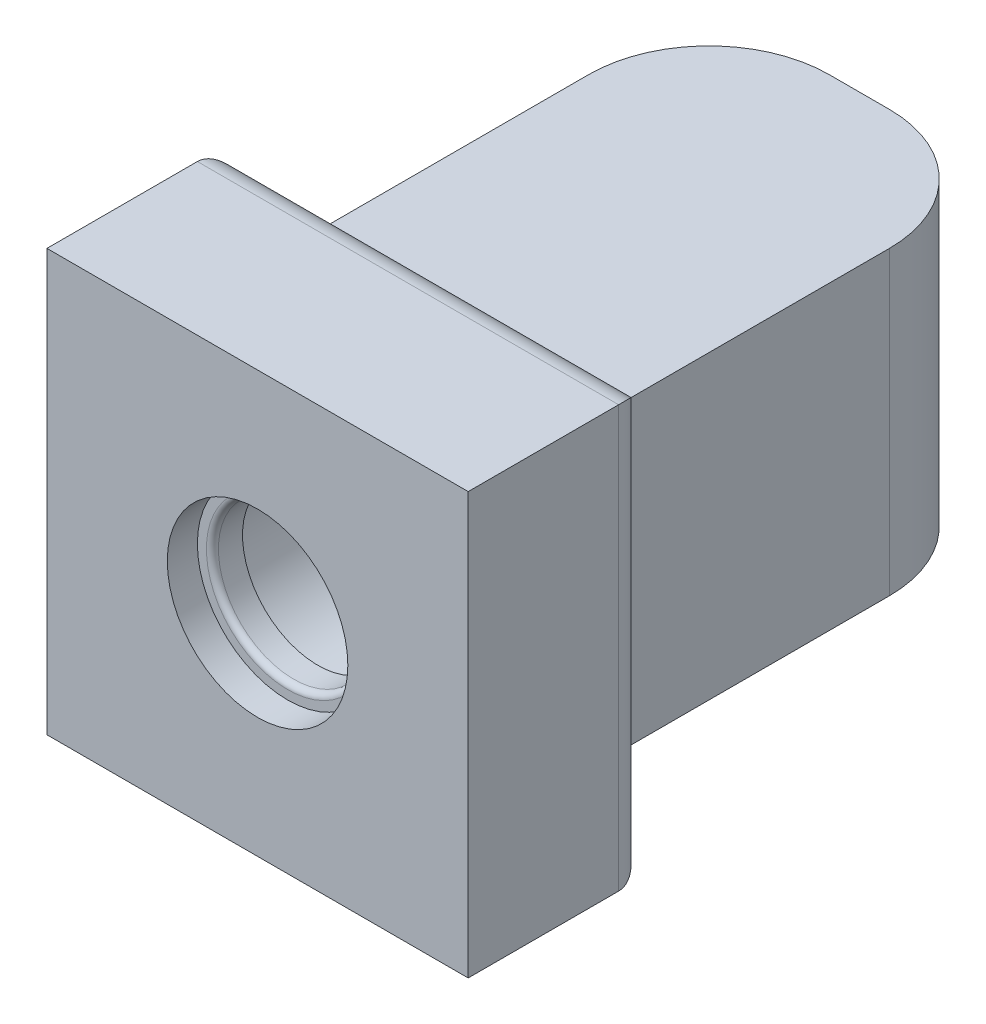
ISO-10303-21;
HEADER;
FILE_DESCRIPTION(('STEP AP214'),'2;1');
FILE_NAME('part.step','',(''),(''),'','','');
FILE_SCHEMA(('AUTOMOTIVE_DESIGN { 1 0 10303 214 1 1 1 1 }'));
ENDSEC;
DATA;
#1=APPLICATION_CONTEXT('core data for automotive mechanical design processes');
#2=APPLICATION_PROTOCOL_DEFINITION('international standard','automotive_design',2000,#1);
#3=PRODUCT_CONTEXT('',#1,'mechanical');
#4=PRODUCT('Part','Part','',(#3));
#5=PRODUCT_RELATED_PRODUCT_CATEGORY('part','',(#4));
#6=PRODUCT_DEFINITION_FORMATION('','',#4);
#7=PRODUCT_DEFINITION_CONTEXT('part definition',#1,'design');
#8=PRODUCT_DEFINITION('design','',#6,#7);
#9=PRODUCT_DEFINITION_SHAPE('','',#8);
#10=(LENGTH_UNIT() NAMED_UNIT(*) SI_UNIT(.MILLI.,.METRE.));
#11=(NAMED_UNIT(*) PLANE_ANGLE_UNIT() SI_UNIT($,.RADIAN.));
#12=(NAMED_UNIT(*) SI_UNIT($,.STERADIAN.) SOLID_ANGLE_UNIT());
#13=UNCERTAINTY_MEASURE_WITH_UNIT(LENGTH_MEASURE(1.E-05),#10,'distance_accuracy_value','');
#14=(GEOMETRIC_REPRESENTATION_CONTEXT(3) GLOBAL_UNCERTAINTY_ASSIGNED_CONTEXT((#13)) GLOBAL_UNIT_ASSIGNED_CONTEXT((#10,
#11,#12)) REPRESENTATION_CONTEXT('',''));
#15=CARTESIAN_POINT('',(0.,0.,0.));
#16=DIRECTION('',(0.,0.,1.));
#17=DIRECTION('',(1.,0.,0.));
#18=AXIS2_PLACEMENT_3D('',#15,#16,#17);
#19=CARTESIAN_POINT('',(0.,5.,-0.0500000000000001));
#20=DIRECTION('',(0.,-1.,0.));
#21=DIRECTION('',(0.,0.,-1.));
#22=AXIS2_PLACEMENT_3D('',#19,#20,#21);
#23=CYLINDRICAL_SURFACE('',#22,1.5);
#24=CARTESIAN_POINT('',(0.,0.,-0.0500000000000001));
#25=DIRECTION('',(0.,1.,0.));
#26=DIRECTION('',(0.,0.,1.));
#27=AXIS2_PLACEMENT_3D('',#24,#25,#26);
#28=CIRCLE('',#27,1.5);
#29=CARTESIAN_POINT('',(0.,0.,1.45));
#30=VERTEX_POINT('',#29);
#31=EDGE_CURVE('E295',#30,#30,#28,.T.);
#32=ORIENTED_EDGE('',*,*,#31,.F.);
#33=EDGE_LOOP('',(#32));
#34=FACE_BOUND('',#33,.T.);
#35=CARTESIAN_POINT('',(0.,3.,-0.0500000000000001));
#36=DIRECTION('',(0.,1.,0.));
#37=DIRECTION('',(0.,0.,1.));
#38=AXIS2_PLACEMENT_3D('',#35,#36,#37);
#39=CIRCLE('',#38,1.5);
#40=CARTESIAN_POINT('',(0.,3.,1.45));
#41=VERTEX_POINT('',#40);
#42=EDGE_CURVE('E155',#41,#41,#39,.T.);
#43=ORIENTED_EDGE('',*,*,#42,.T.);
#44=EDGE_LOOP('',(#43));
#45=FACE_BOUND('',#44,.T.);
#46=ADVANCED_FACE('F39',(#34,#45),#23,.F.);
#47=CARTESIAN_POINT('',(-0.500000000000001,5.,-1.5));
#48=DIRECTION('',(0.,1.,0.));
#49=DIRECTION('',(0.,0.,1.));
#50=AXIS2_PLACEMENT_3D('',#47,#48,#49);
#51=PLANE('',#50);
#52=DIRECTION('',(0.,0.,1.));
#53=VECTOR('',#52,1.);
#54=CARTESIAN_POINT('',(-2.5,5.,-1.5));
#55=LINE('',#54,#53);
#56=CARTESIAN_POINT('',(-2.5,5.,-1.5));
#57=VERTEX_POINT('',#56);
#58=CARTESIAN_POINT('',(-2.5,5.,3.));
#59=VERTEX_POINT('',#58);
#60=EDGE_CURVE('E316',#57,#59,#55,.T.);
#61=ORIENTED_EDGE('',*,*,#60,.T.);
#62=DIRECTION('',(1.,0.,0.));
#63=VECTOR('',#62,1.);
#64=CARTESIAN_POINT('',(-0.500000000000001,5.,3.));
#65=LINE('',#64,#63);
#66=CARTESIAN_POINT('',(2.5,5.,3.));
#67=VERTEX_POINT('',#66);
#68=EDGE_CURVE('E350',#59,#67,#65,.T.);
#69=ORIENTED_EDGE('',*,*,#68,.T.);
#70=DIRECTION('',(0.,0.,-1.));
#71=VECTOR('',#70,1.);
#72=CARTESIAN_POINT('',(2.5,5.,-1.5));
#73=LINE('',#72,#71);
#74=CARTESIAN_POINT('',(2.5,5.,-1.5));
#75=VERTEX_POINT('',#74);
#76=EDGE_CURVE('E303',#67,#75,#73,.T.);
#77=ORIENTED_EDGE('',*,*,#76,.T.);
#78=CARTESIAN_POINT('',(0.499999999999999,5.,-1.5));
#79=DIRECTION('',(0.,1.,0.));
#80=DIRECTION('',(0.,0.,-1.));
#81=AXIS2_PLACEMENT_3D('',#78,#79,#80);
#82=CIRCLE('',#81,2.);
#83=CARTESIAN_POINT('',(0.499999999999999,5.,-3.5));
#84=VERTEX_POINT('',#83);
#85=EDGE_CURVE('E306',#75,#84,#82,.T.);
#86=ORIENTED_EDGE('',*,*,#85,.T.);
#87=DIRECTION('',(-1.,0.,0.));
#88=VECTOR('',#87,1.);
#89=CARTESIAN_POINT('',(-0.500000000000001,5.,-3.5));
#90=LINE('',#89,#88);
#91=CARTESIAN_POINT('',(-0.5,5.,-3.5));
#92=VERTEX_POINT('',#91);
#93=EDGE_CURVE('E310',#84,#92,#90,.T.);
#94=ORIENTED_EDGE('',*,*,#93,.T.);
#95=CARTESIAN_POINT('',(-0.500000000000001,5.,-1.5));
#96=DIRECTION('',(0.,1.,0.));
#97=DIRECTION('',(0.,0.,1.));
#98=AXIS2_PLACEMENT_3D('',#95,#96,#97);
#99=CIRCLE('',#98,2.);
#100=EDGE_CURVE('E313',#92,#57,#99,.T.);
#101=ORIENTED_EDGE('',*,*,#100,.T.);
#102=EDGE_LOOP('',(#61,#69,#77,#86,#94,#101));
#103=FACE_BOUND('',#102,.T.);
#104=ADVANCED_FACE('F199',(#103),#51,.T.);
#105=CARTESIAN_POINT('',(-0.500000000000001,0.,-1.5));
#106=DIRECTION('',(0.,1.,0.));
#107=DIRECTION('',(0.,0.,1.));
#108=AXIS2_PLACEMENT_3D('',#105,#106,#107);
#109=PLANE('',#108);
#110=DIRECTION('',(0.,0.,-1.));
#111=VECTOR('',#110,1.);
#112=CARTESIAN_POINT('',(2.5,0.,-1.5));
#113=LINE('',#112,#111);
#114=CARTESIAN_POINT('',(2.5,0.,3.));
#115=VERTEX_POINT('',#114);
#116=CARTESIAN_POINT('',(2.5,0.,-1.5));
#117=VERTEX_POINT('',#116);
#118=EDGE_CURVE('E299',#115,#117,#113,.T.);
#119=ORIENTED_EDGE('',*,*,#118,.F.);
#120=DIRECTION('',(1.,0.,0.));
#121=VECTOR('',#120,1.);
#122=CARTESIAN_POINT('',(-2.5,0.,3.));
#123=LINE('',#122,#121);
#124=CARTESIAN_POINT('',(-2.5,0.,3.));
#125=VERTEX_POINT('',#124);
#126=EDGE_CURVE('E357',#115,#125,#123,.F.);
#127=ORIENTED_EDGE('',*,*,#126,.T.);
#128=DIRECTION('',(0.,0.,1.));
#129=VECTOR('',#128,1.);
#130=CARTESIAN_POINT('',(-2.5,0.,-1.5));
#131=LINE('',#130,#129);
#132=CARTESIAN_POINT('',(-2.5,0.,-1.5));
#133=VERTEX_POINT('',#132);
#134=EDGE_CURVE('E307',#133,#125,#131,.T.);
#135=ORIENTED_EDGE('',*,*,#134,.F.);
#136=CARTESIAN_POINT('',(-0.500000000000001,0.,-1.5));
#137=DIRECTION('',(0.,1.,0.));
#138=DIRECTION('',(0.,0.,1.));
#139=AXIS2_PLACEMENT_3D('',#136,#137,#138);
#140=CIRCLE('',#139,2.);
#141=CARTESIAN_POINT('',(-0.5,0.,-3.5));
#142=VERTEX_POINT('',#141);
#143=EDGE_CURVE('E329',#142,#133,#140,.T.);
#144=ORIENTED_EDGE('',*,*,#143,.F.);
#145=DIRECTION('',(-1.,0.,0.));
#146=VECTOR('',#145,1.);
#147=CARTESIAN_POINT('',(-0.500000000000001,0.,-3.5));
#148=LINE('',#147,#146);
#149=CARTESIAN_POINT('',(0.499999999999999,0.,-3.5));
#150=VERTEX_POINT('',#149);
#151=EDGE_CURVE('E326',#150,#142,#148,.T.);
#152=ORIENTED_EDGE('',*,*,#151,.F.);
#153=CARTESIAN_POINT('',(0.499999999999999,0.,-1.5));
#154=DIRECTION('',(0.,1.,0.));
#155=DIRECTION('',(0.,0.,-1.));
#156=AXIS2_PLACEMENT_3D('',#153,#154,#155);
#157=CIRCLE('',#156,2.);
#158=EDGE_CURVE('E323',#117,#150,#157,.T.);
#159=ORIENTED_EDGE('',*,*,#158,.F.);
#160=EDGE_LOOP('',(#119,#127,#135,#144,#152,#159));
#161=FACE_BOUND('',#160,.T.);
#162=ORIENTED_EDGE('',*,*,#31,.T.);
#163=EDGE_LOOP('',(#162));
#164=FACE_BOUND('',#163,.T.);
#165=ADVANCED_FACE('F205',(#161,#164),#109,.F.);
#166=CARTESIAN_POINT('',(2.5,5.,-1.5));
#167=DIRECTION('',(-1.,0.,0.));
#168=DIRECTION('',(0.,0.,1.));
#169=AXIS2_PLACEMENT_3D('',#166,#167,#168);
#170=PLANE('',#169);
#171=ORIENTED_EDGE('',*,*,#76,.F.);
#172=DIRECTION('',(0.,-1.,0.));
#173=VECTOR('',#172,1.);
#174=CARTESIAN_POINT('',(2.5,0.,3.));
#175=LINE('',#174,#173);
#176=EDGE_CURVE('E354',#67,#115,#175,.T.);
#177=ORIENTED_EDGE('',*,*,#176,.T.);
#178=ORIENTED_EDGE('',*,*,#118,.T.);
#179=DIRECTION('',(0.,-1.,0.));
#180=VECTOR('',#179,1.);
#181=CARTESIAN_POINT('',(2.5,5.,-1.5));
#182=LINE('',#181,#180);
#183=EDGE_CURVE('E346',#75,#117,#182,.T.);
#184=ORIENTED_EDGE('',*,*,#183,.F.);
#185=EDGE_LOOP('',(#171,#177,#178,#184));
#186=FACE_BOUND('',#185,.T.);
#187=ADVANCED_FACE('F216',(#186),#170,.F.);
#188=CARTESIAN_POINT('',(0.499999999999999,5.,-1.5));
#189=DIRECTION('',(0.,-1.,0.));
#190=DIRECTION('',(0.,0.,-1.));
#191=AXIS2_PLACEMENT_3D('',#188,#189,#190);
#192=CYLINDRICAL_SURFACE('',#191,2.);
#193=ORIENTED_EDGE('',*,*,#158,.T.);
#194=DIRECTION('',(0.,-1.,0.));
#195=VECTOR('',#194,1.);
#196=CARTESIAN_POINT('',(0.499999999999999,5.,-3.5));
#197=LINE('',#196,#195);
#198=EDGE_CURVE('E342',#84,#150,#197,.T.);
#199=ORIENTED_EDGE('',*,*,#198,.F.);
#200=ORIENTED_EDGE('',*,*,#85,.F.);
#201=ORIENTED_EDGE('',*,*,#183,.T.);
#202=EDGE_LOOP('',(#193,#199,#200,#201));
#203=FACE_BOUND('',#202,.T.);
#204=ADVANCED_FACE('F229',(#203),#192,.T.);
#205=CARTESIAN_POINT('',(-0.500000000000001,5.,-3.5));
#206=DIRECTION('',(0.,0.,1.));
#207=DIRECTION('',(1.,0.,0.));
#208=AXIS2_PLACEMENT_3D('',#205,#206,#207);
#209=PLANE('',#208);
#210=ORIENTED_EDGE('',*,*,#151,.T.);
#211=DIRECTION('',(0.,-1.,0.));
#212=VECTOR('',#211,1.);
#213=CARTESIAN_POINT('',(-0.5,5.,-3.5));
#214=LINE('',#213,#212);
#215=EDGE_CURVE('E338',#92,#142,#214,.T.);
#216=ORIENTED_EDGE('',*,*,#215,.F.);
#217=ORIENTED_EDGE('',*,*,#93,.F.);
#218=ORIENTED_EDGE('',*,*,#198,.T.);
#219=EDGE_LOOP('',(#210,#216,#217,#218));
#220=FACE_BOUND('',#219,.T.);
#221=ADVANCED_FACE('F225',(#220),#209,.F.);
#222=CARTESIAN_POINT('',(-0.500000000000001,5.,-1.5));
#223=DIRECTION('',(0.,-1.,0.));
#224=DIRECTION('',(0.,0.,-1.));
#225=AXIS2_PLACEMENT_3D('',#222,#223,#224);
#226=CYLINDRICAL_SURFACE('',#225,2.);
#227=ORIENTED_EDGE('',*,*,#143,.T.);
#228=DIRECTION('',(0.,-1.,0.));
#229=VECTOR('',#228,1.);
#230=CARTESIAN_POINT('',(-2.5,5.,-1.5));
#231=LINE('',#230,#229);
#232=EDGE_CURVE('E320',#57,#133,#231,.T.);
#233=ORIENTED_EDGE('',*,*,#232,.F.);
#234=ORIENTED_EDGE('',*,*,#100,.F.);
#235=ORIENTED_EDGE('',*,*,#215,.T.);
#236=EDGE_LOOP('',(#227,#233,#234,#235));
#237=FACE_BOUND('',#236,.T.);
#238=ADVANCED_FACE('F221',(#237),#226,.T.);
#239=CARTESIAN_POINT('',(-2.5,5.,-1.5));
#240=DIRECTION('',(1.,0.,0.));
#241=DIRECTION('',(0.,0.,-1.));
#242=AXIS2_PLACEMENT_3D('',#239,#240,#241);
#243=PLANE('',#242);
#244=ORIENTED_EDGE('',*,*,#134,.T.);
#245=DIRECTION('',(0.,-1.,0.));
#246=VECTOR('',#245,1.);
#247=CARTESIAN_POINT('',(-2.5,5.,3.));
#248=LINE('',#247,#246);
#249=EDGE_CURVE('E162',#125,#59,#248,.F.);
#250=ORIENTED_EDGE('',*,*,#249,.T.);
#251=ORIENTED_EDGE('',*,*,#60,.F.);
#252=ORIENTED_EDGE('',*,*,#232,.T.);
#253=EDGE_LOOP('',(#244,#250,#251,#252));
#254=FACE_BOUND('',#253,.T.);
#255=ADVANCED_FACE('F218',(#254),#243,.F.);
#256=CARTESIAN_POINT('',(0.,3.,-0.0500000000000001));
#257=DIRECTION('',(0.,1.,0.));
#258=DIRECTION('',(0.,0.,1.));
#259=AXIS2_PLACEMENT_3D('',#256,#257,#258);
#260=PLANE('',#259);
#261=ORIENTED_EDGE('',*,*,#42,.F.);
#262=EDGE_LOOP('',(#261));
#263=FACE_BOUND('',#262,.T.);
#264=ADVANCED_FACE('F211',(#263),#260,.F.);
#265=CARTESIAN_POINT('',(-3.5,6.,6.5));
#266=DIRECTION('',(1.,0.,0.));
#267=DIRECTION('',(0.,0.,-1.));
#268=AXIS2_PLACEMENT_3D('',#265,#266,#267);
#269=PLANE('',#268);
#270=DIRECTION('',(0.,0.,-1.));
#271=VECTOR('',#270,1.);
#272=CARTESIAN_POINT('',(-3.5,6.,6.5));
#273=LINE('',#272,#271);
#274=CARTESIAN_POINT('',(-3.5,6.,6.5));
#275=VERTEX_POINT('',#274);
#276=CARTESIAN_POINT('',(-3.5,6.,4.));
#277=VERTEX_POINT('',#276);
#278=EDGE_CURVE('E144',#275,#277,#273,.T.);
#279=ORIENTED_EDGE('',*,*,#278,.T.);
#280=DIRECTION('',(0.,-1.,0.));
#281=VECTOR('',#280,1.);
#282=CARTESIAN_POINT('',(-3.5,6.,4.));
#283=LINE('',#282,#281);
#284=CARTESIAN_POINT('',(-3.5,-1.,4.));
#285=VERTEX_POINT('',#284);
#286=EDGE_CURVE('E140',#277,#285,#283,.T.);
#287=ORIENTED_EDGE('',*,*,#286,.T.);
#288=DIRECTION('',(0.,0.,-1.));
#289=VECTOR('',#288,1.);
#290=CARTESIAN_POINT('',(-3.5,-1.,6.5));
#291=LINE('',#290,#289);
#292=CARTESIAN_POINT('',(-3.5,-1.,6.5));
#293=VERTEX_POINT('',#292);
#294=EDGE_CURVE('E143',#293,#285,#291,.T.);
#295=ORIENTED_EDGE('',*,*,#294,.F.);
#296=DIRECTION('',(0.,-1.,0.));
#297=VECTOR('',#296,1.);
#298=CARTESIAN_POINT('',(-3.5,6.,6.5));
#299=LINE('',#298,#297);
#300=EDGE_CURVE('E170',#275,#293,#299,.T.);
#301=ORIENTED_EDGE('',*,*,#300,.F.);
#302=EDGE_LOOP('',(#279,#287,#295,#301));
#303=FACE_BOUND('',#302,.T.);
#304=ADVANCED_FACE('F141',(#303),#269,.F.);
#305=CARTESIAN_POINT('',(-3.5,-1.,6.5));
#306=DIRECTION('',(0.,1.,0.));
#307=DIRECTION('',(0.,0.,1.));
#308=AXIS2_PLACEMENT_3D('',#305,#306,#307);
#309=PLANE('',#308);
#310=ORIENTED_EDGE('',*,*,#294,.T.);
#311=DIRECTION('',(1.,0.,0.));
#312=VECTOR('',#311,1.);
#313=CARTESIAN_POINT('',(-3.5,-1.,4.));
#314=LINE('',#313,#312);
#315=CARTESIAN_POINT('',(3.5,-1.,4.));
#316=VERTEX_POINT('',#315);
#317=EDGE_CURVE('E152',#285,#316,#314,.T.);
#318=ORIENTED_EDGE('',*,*,#317,.T.);
#319=DIRECTION('',(0.,0.,-1.));
#320=VECTOR('',#319,1.);
#321=CARTESIAN_POINT('',(3.5,-1.,6.5));
#322=LINE('',#321,#320);
#323=CARTESIAN_POINT('',(3.5,-1.,6.5));
#324=VERTEX_POINT('',#323);
#325=EDGE_CURVE('E156',#324,#316,#322,.T.);
#326=ORIENTED_EDGE('',*,*,#325,.F.);
#327=DIRECTION('',(1.,0.,0.));
#328=VECTOR('',#327,1.);
#329=CARTESIAN_POINT('',(-3.5,-1.,6.5));
#330=LINE('',#329,#328);
#331=EDGE_CURVE('E88',#293,#324,#330,.T.);
#332=ORIENTED_EDGE('',*,*,#331,.F.);
#333=EDGE_LOOP('',(#310,#318,#326,#332));
#334=FACE_BOUND('',#333,.T.);
#335=ADVANCED_FACE('F151',(#334),#309,.F.);
#336=CARTESIAN_POINT('',(3.5,-1.,6.5));
#337=DIRECTION('',(-1.,0.,0.));
#338=DIRECTION('',(0.,0.,1.));
#339=AXIS2_PLACEMENT_3D('',#336,#337,#338);
#340=PLANE('',#339);
#341=ORIENTED_EDGE('',*,*,#325,.T.);
#342=DIRECTION('',(0.,1.,0.));
#343=VECTOR('',#342,1.);
#344=CARTESIAN_POINT('',(3.5,-1.,4.));
#345=LINE('',#344,#343);
#346=CARTESIAN_POINT('',(3.5,6.,4.));
#347=VERTEX_POINT('',#346);
#348=EDGE_CURVE('E161',#316,#347,#345,.T.);
#349=ORIENTED_EDGE('',*,*,#348,.T.);
#350=DIRECTION('',(0.,0.,-1.));
#351=VECTOR('',#350,1.);
#352=CARTESIAN_POINT('',(3.5,6.,6.5));
#353=LINE('',#352,#351);
#354=CARTESIAN_POINT('',(3.5,6.,6.5));
#355=VERTEX_POINT('',#354);
#356=EDGE_CURVE('E425',#355,#347,#353,.T.);
#357=ORIENTED_EDGE('',*,*,#356,.F.);
#358=DIRECTION('',(0.,1.,0.));
#359=VECTOR('',#358,1.);
#360=CARTESIAN_POINT('',(3.5,-1.,6.5));
#361=LINE('',#360,#359);
#362=EDGE_CURVE('E436',#324,#355,#361,.T.);
#363=ORIENTED_EDGE('',*,*,#362,.F.);
#364=EDGE_LOOP('',(#341,#349,#357,#363));
#365=FACE_BOUND('',#364,.T.);
#366=ADVANCED_FACE('F275',(#365),#340,.F.);
#367=CARTESIAN_POINT('',(3.5,6.,6.5));
#368=DIRECTION('',(0.,-1.,0.));
#369=DIRECTION('',(0.,0.,-1.));
#370=AXIS2_PLACEMENT_3D('',#367,#368,#369);
#371=PLANE('',#370);
#372=ORIENTED_EDGE('',*,*,#356,.T.);
#373=DIRECTION('',(-1.,0.,0.));
#374=VECTOR('',#373,1.);
#375=CARTESIAN_POINT('',(3.5,6.,4.));
#376=LINE('',#375,#374);
#377=EDGE_CURVE('E57',#347,#277,#376,.T.);
#378=ORIENTED_EDGE('',*,*,#377,.T.);
#379=ORIENTED_EDGE('',*,*,#278,.F.);
#380=DIRECTION('',(-1.,0.,0.));
#381=VECTOR('',#380,1.);
#382=CARTESIAN_POINT('',(3.5,6.,6.5));
#383=LINE('',#382,#381);
#384=EDGE_CURVE('E427',#355,#275,#383,.T.);
#385=ORIENTED_EDGE('',*,*,#384,.F.);
#386=EDGE_LOOP('',(#372,#378,#379,#385));
#387=FACE_BOUND('',#386,.T.);
#388=ADVANCED_FACE('F268',(#387),#371,.F.);
#389=CARTESIAN_POINT('',(0.,0.,6.5));
#390=DIRECTION('',(0.,0.,1.));
#391=DIRECTION('',(1.,0.,0.));
#392=AXIS2_PLACEMENT_3D('',#389,#390,#391);
#393=PLANE('',#392);
#394=CARTESIAN_POINT('',(0.,2.5,6.5));
#395=DIRECTION('',(0.,0.,1.));
#396=DIRECTION('',(1.,0.,0.));
#397=AXIS2_PLACEMENT_3D('',#394,#395,#396);
#398=CIRCLE('',#397,1.5);
#399=CARTESIAN_POINT('',(1.5,2.5,6.5));
#400=VERTEX_POINT('',#399);
#401=EDGE_CURVE('E441',#400,#400,#398,.T.);
#402=ORIENTED_EDGE('',*,*,#401,.F.);
#403=EDGE_LOOP('',(#402));
#404=FACE_BOUND('',#403,.T.);
#405=ORIENTED_EDGE('',*,*,#300,.T.);
#406=ORIENTED_EDGE('',*,*,#331,.T.);
#407=ORIENTED_EDGE('',*,*,#362,.T.);
#408=ORIENTED_EDGE('',*,*,#384,.T.);
#409=EDGE_LOOP('',(#405,#406,#407,#408));
#410=FACE_BOUND('',#409,.T.);
#411=ADVANCED_FACE('F263',(#404,#410),#393,.T.);
#412=CARTESIAN_POINT('',(-3.5,-0.5,4.));
#413=DIRECTION('',(1.,0.,0.));
#414=DIRECTION('',(0.,0.,-1.));
#415=AXIS2_PLACEMENT_3D('',#412,#413,#414);
#416=CYLINDRICAL_SURFACE('',#415,0.5);
#417=CARTESIAN_POINT('',(3.,-0.5,4.));
#418=DIRECTION('',(0.707106781186547,0.707106781186547,0.));
#419=DIRECTION('',(-0.707106781186547,0.707106781186547,0.));
#420=AXIS2_PLACEMENT_3D('',#417,#418,#419);
#421=ELLIPSE('',#420,0.707106781186547,0.5);
#422=CARTESIAN_POINT('',(3.,-0.5,3.5));
#423=VERTEX_POINT('',#422);
#424=EDGE_CURVE('E159',#316,#423,#421,.T.);
#425=ORIENTED_EDGE('',*,*,#424,.F.);
#426=ORIENTED_EDGE('',*,*,#317,.F.);
#427=CARTESIAN_POINT('',(-3.,-0.5,4.));
#428=DIRECTION('',(0.707106781186547,-0.707106781186547,0.));
#429=DIRECTION('',(-0.707106781186547,-0.707106781186547,0.));
#430=AXIS2_PLACEMENT_3D('',#427,#428,#429);
#431=ELLIPSE('',#430,0.707106781186547,0.5);
#432=CARTESIAN_POINT('',(-3.,-0.5,3.5));
#433=VERTEX_POINT('',#432);
#434=EDGE_CURVE('E80',#433,#285,#431,.F.);
#435=ORIENTED_EDGE('',*,*,#434,.F.);
#436=DIRECTION('',(1.,0.,0.));
#437=VECTOR('',#436,1.);
#438=CARTESIAN_POINT('',(0.,-0.5,3.5));
#439=LINE('',#438,#437);
#440=EDGE_CURVE('E75',#423,#433,#439,.F.);
#441=ORIENTED_EDGE('',*,*,#440,.F.);
#442=EDGE_LOOP('',(#425,#426,#435,#441));
#443=FACE_BOUND('',#442,.T.);
#444=ADVANCED_FACE('F158',(#443),#416,.T.);
#445=CARTESIAN_POINT('',(-3.,6.,4.));
#446=DIRECTION('',(0.,-1.,0.));
#447=DIRECTION('',(0.,0.,-1.));
#448=AXIS2_PLACEMENT_3D('',#445,#446,#447);
#449=CYLINDRICAL_SURFACE('',#448,0.5);
#450=ORIENTED_EDGE('',*,*,#434,.T.);
#451=ORIENTED_EDGE('',*,*,#286,.F.);
#452=CARTESIAN_POINT('',(-3.,5.5,4.));
#453=DIRECTION('',(-0.707106781186547,-0.707106781186547,0.));
#454=DIRECTION('',(0.707106781186547,-0.707106781186547,0.));
#455=AXIS2_PLACEMENT_3D('',#452,#453,#454);
#456=ELLIPSE('',#455,0.707106781186547,0.5);
#457=CARTESIAN_POINT('',(-3.,5.5,3.5));
#458=VERTEX_POINT('',#457);
#459=EDGE_CURVE('E391',#458,#277,#456,.F.);
#460=ORIENTED_EDGE('',*,*,#459,.F.);
#461=DIRECTION('',(0.,-1.,0.));
#462=VECTOR('',#461,1.);
#463=CARTESIAN_POINT('',(-3.,0.,3.5));
#464=LINE('',#463,#462);
#465=EDGE_CURVE('E167',#433,#458,#464,.F.);
#466=ORIENTED_EDGE('',*,*,#465,.F.);
#467=EDGE_LOOP('',(#450,#451,#460,#466));
#468=FACE_BOUND('',#467,.T.);
#469=ADVANCED_FACE('F165',(#468),#449,.T.);
#470=CARTESIAN_POINT('',(0.,-0.5,3.));
#471=DIRECTION('',(-1.,0.,0.));
#472=DIRECTION('',(0.,0.,1.));
#473=AXIS2_PLACEMENT_3D('',#470,#471,#472);
#474=CYLINDRICAL_SURFACE('',#473,0.5);
#475=CARTESIAN_POINT('',(3.,-0.5,3.));
#476=DIRECTION('',(-0.707106781186547,-0.707106781186547,0.));
#477=DIRECTION('',(-0.707106781186547,0.707106781186547,0.));
#478=AXIS2_PLACEMENT_3D('',#475,#476,#477);
#479=ELLIPSE('',#478,0.707106781186547,0.5);
#480=EDGE_CURVE('E382',#423,#115,#479,.T.);
#481=ORIENTED_EDGE('',*,*,#480,.F.);
#482=ORIENTED_EDGE('',*,*,#440,.T.);
#483=CARTESIAN_POINT('',(-3.,-0.5,3.));
#484=DIRECTION('',(-0.707106781186547,0.707106781186547,0.));
#485=DIRECTION('',(0.707106781186547,0.707106781186547,0.));
#486=AXIS2_PLACEMENT_3D('',#483,#484,#485);
#487=ELLIPSE('',#486,0.707106781186547,0.5);
#488=EDGE_CURVE('E386',#125,#433,#487,.F.);
#489=ORIENTED_EDGE('',*,*,#488,.F.);
#490=ORIENTED_EDGE('',*,*,#126,.F.);
#491=EDGE_LOOP('',(#481,#482,#489,#490));
#492=FACE_BOUND('',#491,.T.);
#493=ADVANCED_FACE('F256',(#492),#474,.F.);
#494=CARTESIAN_POINT('',(3.,-1.,4.));
#495=DIRECTION('',(0.,1.,0.));
#496=DIRECTION('',(0.,0.,1.));
#497=AXIS2_PLACEMENT_3D('',#494,#495,#496);
#498=CYLINDRICAL_SURFACE('',#497,0.5);
#499=CARTESIAN_POINT('',(3.,5.5,4.));
#500=DIRECTION('',(-0.707106781186547,0.707106781186547,0.));
#501=DIRECTION('',(-0.707106781186547,-0.707106781186547,0.));
#502=AXIS2_PLACEMENT_3D('',#499,#500,#501);
#503=ELLIPSE('',#502,0.707106781186547,0.5);
#504=CARTESIAN_POINT('',(3.,5.5,3.5));
#505=VERTEX_POINT('',#504);
#506=EDGE_CURVE('E394',#347,#505,#503,.T.);
#507=ORIENTED_EDGE('',*,*,#506,.F.);
#508=ORIENTED_EDGE('',*,*,#348,.F.);
#509=ORIENTED_EDGE('',*,*,#424,.T.);
#510=DIRECTION('',(0.,1.,0.));
#511=VECTOR('',#510,1.);
#512=CARTESIAN_POINT('',(3.,0.,3.5));
#513=LINE('',#512,#511);
#514=EDGE_CURVE('E378',#505,#423,#513,.F.);
#515=ORIENTED_EDGE('',*,*,#514,.F.);
#516=EDGE_LOOP('',(#507,#508,#509,#515));
#517=FACE_BOUND('',#516,.T.);
#518=ADVANCED_FACE('F252',(#517),#498,.T.);
#519=CARTESIAN_POINT('',(3.5,5.5,4.));
#520=DIRECTION('',(-1.,0.,0.));
#521=DIRECTION('',(0.,0.,1.));
#522=AXIS2_PLACEMENT_3D('',#519,#520,#521);
#523=CYLINDRICAL_SURFACE('',#522,0.5);
#524=ORIENTED_EDGE('',*,*,#377,.F.);
#525=ORIENTED_EDGE('',*,*,#506,.T.);
#526=DIRECTION('',(-1.,0.,0.));
#527=VECTOR('',#526,1.);
#528=CARTESIAN_POINT('',(0.,5.5,3.5));
#529=LINE('',#528,#527);
#530=EDGE_CURVE('E374',#458,#505,#529,.F.);
#531=ORIENTED_EDGE('',*,*,#530,.F.);
#532=ORIENTED_EDGE('',*,*,#459,.T.);
#533=EDGE_LOOP('',(#524,#525,#531,#532));
#534=FACE_BOUND('',#533,.T.);
#535=ADVANCED_FACE('F248',(#534),#523,.T.);
#536=CARTESIAN_POINT('',(-3.,0.,3.));
#537=DIRECTION('',(0.,1.,0.));
#538=DIRECTION('',(0.,0.,1.));
#539=AXIS2_PLACEMENT_3D('',#536,#537,#538);
#540=CYLINDRICAL_SURFACE('',#539,0.5);
#541=ORIENTED_EDGE('',*,*,#488,.T.);
#542=ORIENTED_EDGE('',*,*,#465,.T.);
#543=CARTESIAN_POINT('',(-3.,5.5,3.));
#544=DIRECTION('',(0.707106781186547,0.707106781186547,0.));
#545=DIRECTION('',(-0.707106781186547,0.707106781186547,0.));
#546=AXIS2_PLACEMENT_3D('',#543,#544,#545);
#547=ELLIPSE('',#546,0.707106781186547,0.5);
#548=EDGE_CURVE('E369',#59,#458,#547,.F.);
#549=ORIENTED_EDGE('',*,*,#548,.F.);
#550=ORIENTED_EDGE('',*,*,#249,.F.);
#551=EDGE_LOOP('',(#541,#542,#549,#550));
#552=FACE_BOUND('',#551,.T.);
#553=ADVANCED_FACE('F244',(#552),#540,.F.);
#554=CARTESIAN_POINT('',(3.,5.,3.));
#555=DIRECTION('',(0.,1.,0.));
#556=DIRECTION('',(0.,0.,1.));
#557=AXIS2_PLACEMENT_3D('',#554,#555,#556);
#558=CYLINDRICAL_SURFACE('',#557,0.5);
#559=ORIENTED_EDGE('',*,*,#480,.T.);
#560=ORIENTED_EDGE('',*,*,#176,.F.);
#561=CARTESIAN_POINT('',(3.,5.5,3.));
#562=DIRECTION('',(-0.707106781186547,0.707106781186547,0.));
#563=DIRECTION('',(0.707106781186547,0.707106781186547,0.));
#564=AXIS2_PLACEMENT_3D('',#561,#562,#563);
#565=ELLIPSE('',#564,0.707106781186547,0.5);
#566=EDGE_CURVE('E366',#505,#67,#565,.F.);
#567=ORIENTED_EDGE('',*,*,#566,.F.);
#568=ORIENTED_EDGE('',*,*,#514,.T.);
#569=EDGE_LOOP('',(#559,#560,#567,#568));
#570=FACE_BOUND('',#569,.T.);
#571=ADVANCED_FACE('F240',(#570),#558,.F.);
#572=CARTESIAN_POINT('',(-0.500000000000001,5.5,3.));
#573=DIRECTION('',(1.,0.,0.));
#574=DIRECTION('',(0.,0.,-1.));
#575=AXIS2_PLACEMENT_3D('',#572,#573,#574);
#576=CYLINDRICAL_SURFACE('',#575,0.5);
#577=ORIENTED_EDGE('',*,*,#548,.T.);
#578=ORIENTED_EDGE('',*,*,#530,.T.);
#579=ORIENTED_EDGE('',*,*,#566,.T.);
#580=ORIENTED_EDGE('',*,*,#68,.F.);
#581=EDGE_LOOP('',(#577,#578,#579,#580));
#582=FACE_BOUND('',#581,.T.);
#583=ADVANCED_FACE('F237',(#582),#576,.F.);
#584=CARTESIAN_POINT('',(0.,2.5,3.5));
#585=DIRECTION('',(0.,0.,1.));
#586=DIRECTION('',(1.,0.,0.));
#587=AXIS2_PLACEMENT_3D('',#584,#585,#586);
#588=CYLINDRICAL_SURFACE('',#587,1.5);
#589=CARTESIAN_POINT('',(0.,2.5,6.));
#590=DIRECTION('',(0.,0.,1.));
#591=DIRECTION('',(1.,0.,0.));
#592=AXIS2_PLACEMENT_3D('',#589,#590,#591);
#593=CIRCLE('',#592,1.5);
#594=CARTESIAN_POINT('',(1.5,2.5,6.));
#595=VERTEX_POINT('',#594);
#596=EDGE_CURVE('E445',#595,#595,#593,.T.);
#597=ORIENTED_EDGE('',*,*,#596,.F.);
#598=EDGE_LOOP('',(#597));
#599=FACE_BOUND('',#598,.T.);
#600=ORIENTED_EDGE('',*,*,#401,.T.);
#601=EDGE_LOOP('',(#600));
#602=FACE_BOUND('',#601,.T.);
#603=ADVANCED_FACE('F196',(#599,#602),#588,.F.);
#604=CARTESIAN_POINT('',(0.,2.5,5.5));
#605=DIRECTION('',(0.,0.,1.));
#606=DIRECTION('',(1.,0.,0.));
#607=AXIS2_PLACEMENT_3D('',#604,#605,#606);
#608=PLANE('',#607);
#609=CARTESIAN_POINT('',(0.,2.5,5.5));
#610=DIRECTION('',(0.,0.,1.));
#611=DIRECTION('',(1.,0.,0.));
#612=AXIS2_PLACEMENT_3D('',#609,#610,#611);
#613=CIRCLE('',#612,1.25);
#614=CARTESIAN_POINT('',(1.25,2.5,5.5));
#615=VERTEX_POINT('',#614);
#616=EDGE_CURVE('E452',#615,#615,#613,.T.);
#617=ORIENTED_EDGE('',*,*,#616,.T.);
#618=EDGE_LOOP('',(#617));
#619=FACE_BOUND('',#618,.T.);
#620=CARTESIAN_POINT('',(0.,2.5,5.5));
#621=DIRECTION('',(0.,0.,1.));
#622=DIRECTION('',(1.,0.,0.));
#623=AXIS2_PLACEMENT_3D('',#620,#621,#622);
#624=CIRCLE('',#623,1.5);
#625=CARTESIAN_POINT('',(1.5,2.5,5.5));
#626=VERTEX_POINT('',#625);
#627=EDGE_CURVE('E148',#626,#626,#624,.F.);
#628=ORIENTED_EDGE('',*,*,#627,.T.);
#629=EDGE_LOOP('',(#628));
#630=FACE_BOUND('',#629,.T.);
#631=ADVANCED_FACE('F457',(#619,#630),#608,.F.);
#632=CARTESIAN_POINT('',(0.,2.5,6.));
#633=DIRECTION('',(0.,0.,1.));
#634=DIRECTION('',(1.,0.,0.));
#635=AXIS2_PLACEMENT_3D('',#632,#633,#634);
#636=PLANE('',#635);
#637=CARTESIAN_POINT('',(0.,2.5,6.));
#638=DIRECTION('',(0.,0.,1.));
#639=DIRECTION('',(1.,0.,0.));
#640=AXIS2_PLACEMENT_3D('',#637,#638,#639);
#641=CIRCLE('',#640,1.35);
#642=CARTESIAN_POINT('',(1.35,2.5,6.));
#643=VERTEX_POINT('',#642);
#644=EDGE_CURVE('E11',#643,#643,#641,.F.);
#645=ORIENTED_EDGE('',*,*,#644,.T.);
#646=EDGE_LOOP('',(#645));
#647=FACE_BOUND('',#646,.T.);
#648=ORIENTED_EDGE('',*,*,#596,.T.);
#649=EDGE_LOOP('',(#648));
#650=FACE_BOUND('',#649,.T.);
#651=ADVANCED_FACE('F460',(#647,#650),#636,.T.);
#652=CARTESIAN_POINT('',(0.,2.5,5.5));
#653=DIRECTION('',(0.,0.,1.));
#654=DIRECTION('',(1.,0.,0.));
#655=AXIS2_PLACEMENT_3D('',#652,#653,#654);
#656=CYLINDRICAL_SURFACE('',#655,1.25);
#657=CARTESIAN_POINT('',(0.,2.5,5.9));
#658=DIRECTION('',(0.,0.,1.));
#659=DIRECTION('',(1.,0.,0.));
#660=AXIS2_PLACEMENT_3D('',#657,#658,#659);
#661=CIRCLE('',#660,1.25);
#662=CARTESIAN_POINT('',(1.25,2.5,5.9));
#663=VERTEX_POINT('',#662);
#664=EDGE_CURVE('E49',#663,#663,#661,.T.);
#665=ORIENTED_EDGE('',*,*,#664,.T.);
#666=EDGE_LOOP('',(#665));
#667=FACE_BOUND('',#666,.T.);
#668=ORIENTED_EDGE('',*,*,#616,.F.);
#669=EDGE_LOOP('',(#668));
#670=FACE_BOUND('',#669,.T.);
#671=ADVANCED_FACE('F184',(#667,#670),#656,.F.);
#672=CARTESIAN_POINT('',(0.,2.5,3.5));
#673=DIRECTION('',(0.,0.,1.));
#674=DIRECTION('',(1.,0.,0.));
#675=AXIS2_PLACEMENT_3D('',#672,#673,#674);
#676=PLANE('',#675);
#677=CARTESIAN_POINT('',(0.,2.5,3.5));
#678=DIRECTION('',(0.,0.,1.));
#679=DIRECTION('',(1.,0.,0.));
#680=AXIS2_PLACEMENT_3D('',#677,#678,#679);
#681=CIRCLE('',#680,1.5);
#682=CARTESIAN_POINT('',(1.5,2.5,3.5));
#683=VERTEX_POINT('',#682);
#684=EDGE_CURVE('E370',#683,#683,#681,.T.);
#685=ORIENTED_EDGE('',*,*,#684,.T.);
#686=EDGE_LOOP('',(#685));
#687=FACE_BOUND('',#686,.T.);
#688=ADVANCED_FACE('F193',(#687),#676,.T.);
#689=ORIENTED_EDGE('',*,*,#684,.F.);
#690=EDGE_LOOP('',(#689));
#691=FACE_BOUND('',#690,.T.);
#692=ORIENTED_EDGE('',*,*,#627,.F.);
#693=EDGE_LOOP('',(#692));
#694=FACE_BOUND('',#693,.T.);
#695=ADVANCED_FACE('F188',(#691,#694),#588,.F.);
#696=CARTESIAN_POINT('',(0.,2.5,5.9));
#697=DIRECTION('',(0.,0.,1.));
#698=DIRECTION('',(1.,0.,0.));
#699=AXIS2_PLACEMENT_3D('',#696,#697,#698);
#700=TOROIDAL_SURFACE('',#699,1.35,0.1);
#701=ORIENTED_EDGE('',*,*,#644,.F.);
#702=EDGE_LOOP('',(#701));
#703=FACE_BOUND('',#702,.T.);
#704=ORIENTED_EDGE('',*,*,#664,.F.);
#705=EDGE_LOOP('',(#704));
#706=FACE_BOUND('',#705,.T.);
#707=ADVANCED_FACE('F41',(#703,#706),#700,.T.);
#708=CLOSED_SHELL('',(#46,#104,#165,#187,#204,#221,#238,#255,#264,#304,#335,#366,#388,#411,#444,
#469,#493,#518,#535,#553,#571,#583,#603,#631,#651,#671,#688,#695,#707));
#709=MANIFOLD_SOLID_BREP('B2',#708);
#710=ADVANCED_BREP_SHAPE_REPRESENTATION('',(#18,#709),#14);
#711=SHAPE_DEFINITION_REPRESENTATION(#9,#710);
ENDSEC;
END-ISO-10303-21;
